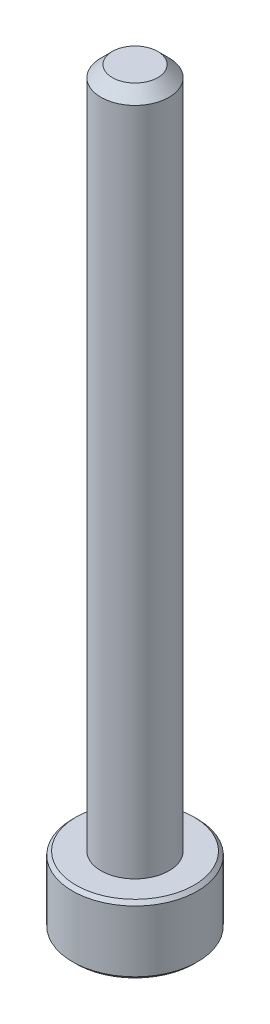
ISO-10303-21;
HEADER;
FILE_DESCRIPTION(('STEP AP214'),'2;1');
FILE_NAME('part.step','',(''),(''),'','','');
FILE_SCHEMA(('AUTOMOTIVE_DESIGN { 1 0 10303 214 1 1 1 1 }'));
ENDSEC;
DATA;
#1=APPLICATION_CONTEXT('core data for automotive mechanical design processes');
#2=APPLICATION_PROTOCOL_DEFINITION('international standard','automotive_design',2000,#1);
#3=PRODUCT_CONTEXT('',#1,'mechanical');
#4=PRODUCT('Part','Part','',(#3));
#5=PRODUCT_RELATED_PRODUCT_CATEGORY('part','',(#4));
#6=PRODUCT_DEFINITION_FORMATION('','',#4);
#7=PRODUCT_DEFINITION_CONTEXT('part definition',#1,'design');
#8=PRODUCT_DEFINITION('design','',#6,#7);
#9=PRODUCT_DEFINITION_SHAPE('','',#8);
#10=(LENGTH_UNIT() NAMED_UNIT(*) SI_UNIT(.MILLI.,.METRE.));
#11=(NAMED_UNIT(*) PLANE_ANGLE_UNIT() SI_UNIT($,.RADIAN.));
#12=(NAMED_UNIT(*) SI_UNIT($,.STERADIAN.) SOLID_ANGLE_UNIT());
#13=UNCERTAINTY_MEASURE_WITH_UNIT(LENGTH_MEASURE(1.E-05),#10,'distance_accuracy_value','');
#14=(GEOMETRIC_REPRESENTATION_CONTEXT(3) GLOBAL_UNCERTAINTY_ASSIGNED_CONTEXT((#13)) GLOBAL_UNIT_ASSIGNED_CONTEXT((#10,
#11,#12)) REPRESENTATION_CONTEXT('',''));
#15=CARTESIAN_POINT('',(0.,0.,0.));
#16=DIRECTION('',(0.,0.,1.));
#17=DIRECTION('',(1.,0.,0.));
#18=AXIS2_PLACEMENT_3D('',#15,#16,#17);
#19=CARTESIAN_POINT('',(-18.4752086140679,34.999999906,-1.25693312378463E-13));
#20=DIRECTION('',(0.,-1.,0.));
#21=DIRECTION('',(0.234491362032753,0.,0.972118203271611));
#22=AXIS2_PLACEMENT_3D('',#19,#20,#21);
#23=CONICAL_SURFACE('',#22,1.,0.785398163397442);
#24=CARTESIAN_POINT('',(-18.4752086140679,34.999999906,-1.25693312378463E-13));
#25=DIRECTION('',(0.,1.,0.));
#26=DIRECTION('',(-0.234491362032753,0.,-0.972118203271611));
#27=AXIS2_PLACEMENT_3D('',#24,#25,#26);
#28=CIRCLE('',#27,1.);
#29=CARTESIAN_POINT('',(-18.7096999761007,34.999999906,-0.972118203271737));
#30=VERTEX_POINT('',#29);
#31=EDGE_CURVE('E240',#30,#30,#28,.T.);
#32=ORIENTED_EDGE('',*,*,#31,.F.);
#33=EDGE_LOOP('',(#32));
#34=FACE_BOUND('',#33,.T.);
#35=CARTESIAN_POINT('',(-18.4752086140679,34.499999906,-1.25669275344883E-13));
#36=DIRECTION('',(0.,1.,0.));
#37=DIRECTION('',(-0.234491362032753,0.,-0.972118203271611));
#38=AXIS2_PLACEMENT_3D('',#35,#36,#37);
#39=CIRCLE('',#38,1.5);
#40=CARTESIAN_POINT('',(-18.8269456571171,34.499999906,-1.45817730490754));
#41=VERTEX_POINT('',#40);
#42=EDGE_CURVE('E11',#41,#41,#39,.T.);
#43=ORIENTED_EDGE('',*,*,#42,.T.);
#44=EDGE_LOOP('',(#43));
#45=FACE_BOUND('',#44,.T.);
#46=ADVANCED_FACE('F16',(#34,#45),#23,.T.);
#47=CARTESIAN_POINT('',(-18.4752086140679,34.999999906,-1.25693312378463E-13));
#48=DIRECTION('',(0.,1.,0.));
#49=DIRECTION('',(-0.234491362032753,0.,-0.972118203271611));
#50=AXIS2_PLACEMENT_3D('',#47,#48,#49);
#51=CYLINDRICAL_SURFACE('',#50,1.5);
#52=CARTESIAN_POINT('',(-18.4752086140679,4.999999906,-1.24251090363675E-13));
#53=DIRECTION('',(0.,1.,0.));
#54=DIRECTION('',(-0.234491362032753,0.,-0.972118203271611));
#55=AXIS2_PLACEMENT_3D('',#52,#53,#54);
#56=CIRCLE('',#55,1.5);
#57=CARTESIAN_POINT('',(-18.8269456571171,4.999999906,-1.45817730490754));
#58=VERTEX_POINT('',#57);
#59=EDGE_CURVE('E243',#58,#58,#56,.T.);
#60=ORIENTED_EDGE('',*,*,#59,.T.);
#61=EDGE_LOOP('',(#60));
#62=FACE_BOUND('',#61,.T.);
#63=ORIENTED_EDGE('',*,*,#42,.F.);
#64=EDGE_LOOP('',(#63));
#65=FACE_BOUND('',#64,.T.);
#66=ADVANCED_FACE('F227',(#62,#65),#51,.T.);
#67=CARTESIAN_POINT('',(-18.4752086140679,4.999999906,-1.24251090363675E-13));
#68=DIRECTION('',(0.,-1.,0.));
#69=DIRECTION('',(0.234491362032753,0.,0.972118203271611));
#70=AXIS2_PLACEMENT_3D('',#67,#68,#69);
#71=CONICAL_SURFACE('',#70,2.6,0.785398163397446);
#72=CARTESIAN_POINT('',(-18.4752086140679,4.999999906,-1.24251090363675E-13));
#73=DIRECTION('',(0.,1.,0.));
#74=DIRECTION('',(-0.234491362032753,0.,-0.972118203271611));
#75=AXIS2_PLACEMENT_3D('',#72,#73,#74);
#76=CIRCLE('',#75,2.6);
#77=CARTESIAN_POINT('',(-19.0848861553531,4.999999906,-2.52750732850631));
#78=VERTEX_POINT('',#77);
#79=EDGE_CURVE('E249',#78,#78,#76,.T.);
#80=ORIENTED_EDGE('',*,*,#79,.F.);
#81=EDGE_LOOP('',(#80));
#82=FACE_BOUND('',#81,.T.);
#83=CARTESIAN_POINT('',(-18.4752086140679,4.849999906,-1.24243879253602E-13));
#84=DIRECTION('',(0.,1.,0.));
#85=DIRECTION('',(-0.234491362032753,0.,-0.972118203271611));
#86=AXIS2_PLACEMENT_3D('',#83,#84,#85);
#87=CIRCLE('',#86,2.75);
#88=CARTESIAN_POINT('',(-19.120059859658,4.849999906,-2.67332505899705));
#89=VERTEX_POINT('',#88);
#90=EDGE_CURVE('E27',#89,#89,#87,.T.);
#91=ORIENTED_EDGE('',*,*,#90,.T.);
#92=EDGE_LOOP('',(#91));
#93=FACE_BOUND('',#92,.T.);
#94=ADVANCED_FACE('F224',(#82,#93),#71,.T.);
#95=CARTESIAN_POINT('',(-18.4752086140679,34.999999906,-1.25693312378463E-13));
#96=DIRECTION('',(0.,1.,0.));
#97=DIRECTION('',(-0.234491362032753,0.,-0.972118203271611));
#98=AXIS2_PLACEMENT_3D('',#95,#96,#97);
#99=CYLINDRICAL_SURFACE('',#98,2.75);
#100=CARTESIAN_POINT('',(-18.4752086140679,2.149999906,-1.24114079272271E-13));
#101=DIRECTION('',(0.,1.,0.));
#102=DIRECTION('',(-0.234491362032753,0.,-0.972118203271611));
#103=AXIS2_PLACEMENT_3D('',#100,#101,#102);
#104=CIRCLE('',#103,2.75);
#105=CARTESIAN_POINT('',(-19.120059859658,2.149999906,-2.67332505899705));
#106=VERTEX_POINT('',#105);
#107=EDGE_CURVE('E256',#106,#106,#104,.T.);
#108=ORIENTED_EDGE('',*,*,#107,.T.);
#109=EDGE_LOOP('',(#108));
#110=FACE_BOUND('',#109,.T.);
#111=ORIENTED_EDGE('',*,*,#90,.F.);
#112=EDGE_LOOP('',(#111));
#113=FACE_BOUND('',#112,.T.);
#114=ADVANCED_FACE('F221',(#110,#113),#99,.T.);
#115=CARTESIAN_POINT('',(-18.4752086140679,2.149999906,-1.24114079272271E-13));
#116=DIRECTION('',(0.,1.,0.));
#117=DIRECTION('',(-0.234491362032753,0.,-0.972118203271611));
#118=AXIS2_PLACEMENT_3D('',#115,#116,#117);
#119=CONICAL_SURFACE('',#118,2.75,0.785398163397457);
#120=CARTESIAN_POINT('',(-18.4752086140679,1.999999906,-1.24106868162197E-13));
#121=DIRECTION('',(0.,1.,0.));
#122=DIRECTION('',(-0.234491362032753,0.,-0.972118203271611));
#123=AXIS2_PLACEMENT_3D('',#120,#121,#122);
#124=CIRCLE('',#123,2.6);
#125=CARTESIAN_POINT('',(-19.0848861553531,1.999999906,-2.52750732850631));
#126=VERTEX_POINT('',#125);
#127=EDGE_CURVE('E253',#126,#126,#124,.T.);
#128=ORIENTED_EDGE('',*,*,#127,.T.);
#129=EDGE_LOOP('',(#128));
#130=FACE_BOUND('',#129,.T.);
#131=ORIENTED_EDGE('',*,*,#107,.F.);
#132=EDGE_LOOP('',(#131));
#133=FACE_BOUND('',#132,.T.);
#134=ADVANCED_FACE('F223',(#130,#133),#119,.T.);
#135=CARTESIAN_POINT('',(-21.0027159425741,1.999999906,0.609677541285032));
#136=DIRECTION('',(0.,-1.,0.));
#137=DIRECTION('',(-1.,0.,0.));
#138=AXIS2_PLACEMENT_3D('',#135,#136,#137);
#139=PLANE('',#138);
#140=CARTESIAN_POINT('',(-18.4752086140679,1.999999906,-1.24106868162197E-13));
#141=DIRECTION('',(0.,-1.,0.));
#142=DIRECTION('',(0.234491362032753,0.,0.972118203271611));
#143=AXIS2_PLACEMENT_3D('',#140,#141,#142);
#144=CIRCLE('',#143,1.44337567297406);
#145=CARTESIAN_POINT('',(-18.1367494865873,1.999999906,1.40313176585737));
#146=VERTEX_POINT('',#145);
#147=CARTESIAN_POINT('',(-19.5211268044172,1.999999906,0.994680085469565));
#148=VERTEX_POINT('',#147);
#149=EDGE_CURVE('E125',#146,#148,#144,.T.);
#150=ORIENTED_EDGE('',*,*,#149,.F.);
#151=CARTESIAN_POINT('',(-18.4752086140679,1.999999906,-1.24106868162197E-13));
#152=DIRECTION('',(0.,-1.,0.));
#153=DIRECTION('',(0.234491362032753,0.,0.972118203271611));
#154=AXIS2_PLACEMENT_3D('',#151,#152,#153);
#155=CIRCLE('',#154,1.44337567297406);
#156=CARTESIAN_POINT('',(-17.0908312962381,1.999999906,0.408451680387684));
#157=VERTEX_POINT('',#156);
#158=EDGE_CURVE('E340',#157,#146,#155,.T.);
#159=ORIENTED_EDGE('',*,*,#158,.F.);
#160=CARTESIAN_POINT('',(-18.4752086140679,1.999999906,-1.24106868162197E-13));
#161=DIRECTION('',(0.,-1.,0.));
#162=DIRECTION('',(0.234491362032753,0.,0.972118203271611));
#163=AXIS2_PLACEMENT_3D('',#160,#161,#162);
#164=CIRCLE('',#163,1.44337567297406);
#165=CARTESIAN_POINT('',(-17.4292904237188,1.999999906,-0.994680085469815));
#166=VERTEX_POINT('',#165);
#167=EDGE_CURVE('E347',#166,#157,#164,.T.);
#168=ORIENTED_EDGE('',*,*,#167,.F.);
#169=CARTESIAN_POINT('',(-18.4752086140679,1.999999906,-1.24106868162197E-13));
#170=DIRECTION('',(0.,-1.,0.));
#171=DIRECTION('',(0.234491362032753,0.,0.972118203271611));
#172=AXIS2_PLACEMENT_3D('',#169,#170,#171);
#173=CIRCLE('',#172,1.44337567297406);
#174=CARTESIAN_POINT('',(-18.8136677415486,1.999999906,-1.40313176585762));
#175=VERTEX_POINT('',#174);
#176=EDGE_CURVE('E355',#175,#166,#173,.T.);
#177=ORIENTED_EDGE('',*,*,#176,.F.);
#178=CARTESIAN_POINT('',(-18.4752086140679,1.999999906,-1.24106868162197E-13));
#179=DIRECTION('',(0.,-1.,0.));
#180=DIRECTION('',(0.234491362032753,0.,0.972118203271611));
#181=AXIS2_PLACEMENT_3D('',#178,#179,#180);
#182=CIRCLE('',#181,1.44337567297406);
#183=CARTESIAN_POINT('',(-19.8595859318977,1.999999906,-0.408451680387932));
#184=VERTEX_POINT('',#183);
#185=EDGE_CURVE('E251',#184,#175,#182,.T.);
#186=ORIENTED_EDGE('',*,*,#185,.F.);
#187=CARTESIAN_POINT('',(-18.4752086140679,1.999999906,-1.24106868162197E-13));
#188=DIRECTION('',(0.,-1.,0.));
#189=DIRECTION('',(0.234491362032753,0.,0.972118203271611));
#190=AXIS2_PLACEMENT_3D('',#187,#188,#189);
#191=CIRCLE('',#190,1.44337567297406);
#192=EDGE_CURVE('E201',#148,#184,#191,.T.);
#193=ORIENTED_EDGE('',*,*,#192,.F.);
#194=EDGE_LOOP('',(#150,#159,#168,#177,#186,#193));
#195=FACE_BOUND('',#194,.T.);
#196=ORIENTED_EDGE('',*,*,#127,.F.);
#197=EDGE_LOOP('',(#196));
#198=FACE_BOUND('',#197,.T.);
#199=ADVANCED_FACE('F219',(#195,#198),#139,.T.);
#200=CARTESIAN_POINT('',(-21.0027159425741,4.999999906,0.609677541285032));
#201=DIRECTION('',(0.,1.,0.));
#202=DIRECTION('',(0.,0.,-1.));
#203=AXIS2_PLACEMENT_3D('',#200,#201,#202);
#204=PLANE('',#203);
#205=ORIENTED_EDGE('',*,*,#79,.T.);
#206=EDGE_LOOP('',(#205));
#207=FACE_BOUND('',#206,.T.);
#208=ORIENTED_EDGE('',*,*,#59,.F.);
#209=EDGE_LOOP('',(#208));
#210=FACE_BOUND('',#209,.T.);
#211=ADVANCED_FACE('F216',(#207,#210),#204,.T.);
#212=CARTESIAN_POINT('',(-19.4473268173395,34.999999906,0.234491362032627));
#213=DIRECTION('',(0.,1.,0.));
#214=DIRECTION('',(0.,0.,-1.));
#215=AXIS2_PLACEMENT_3D('',#212,#213,#214);
#216=PLANE('',#215);
#217=ORIENTED_EDGE('',*,*,#31,.T.);
#218=EDGE_LOOP('',(#217));
#219=FACE_BOUND('',#218,.T.);
#220=ADVANCED_FACE('F214',(#219),#216,.T.);
#221=CARTESIAN_POINT('',(-18.4752086140679,1.999999906,-1.24106868162197E-13));
#222=DIRECTION('',(0.,-1.,0.));
#223=DIRECTION('',(0.234491362032753,0.,0.972118203271611));
#224=AXIS2_PLACEMENT_3D('',#221,#222,#223);
#225=CONICAL_SURFACE('',#224,1.44337567297406,0.78539816339745);
#226=ORIENTED_EDGE('',*,*,#192,.T.);
#227=CARTESIAN_POINT('',(-19.5211268044172,1.999999906,0.994680085469565));
#228=CARTESIAN_POINT('',(-19.611639875145,2.19299863726072,0.619444925735824));
#229=CARTESIAN_POINT('',(-19.6897334658809,2.19337275639813,0.295696534942112));
#230=CARTESIAN_POINT('',(-19.7687199442659,2.19375115304863,-0.0317534520628156));
#231=CARTESIAN_POINT('',(-19.8595859318978,1.999999906,-0.408451680387902));
#232=B_SPLINE_CURVE_WITH_KNOTS('',2,(#227,#228,#229,#230,#231),.UNSPECIFIED.,.F.,.F.,(3,2,3),
(0.,0.5,1.),.UNSPECIFIED.);
#233=EDGE_CURVE('E126',#148,#184,#232,.T.);
#234=ORIENTED_EDGE('',*,*,#233,.F.);
#235=EDGE_LOOP('',(#226,#234));
#236=FACE_BOUND('',#235,.T.);
#237=ADVANCED_FACE('F203',(#236),#225,.F.);
#238=CARTESIAN_POINT('',(-18.4752086140679,1.999999906,-1.24106868162197E-13));
#239=DIRECTION('',(0.,-1.,0.));
#240=DIRECTION('',(0.234491362032753,0.,0.972118203271611));
#241=AXIS2_PLACEMENT_3D('',#238,#239,#240);
#242=CONICAL_SURFACE('',#241,1.44337567297406,0.78539816339745);
#243=ORIENTED_EDGE('',*,*,#185,.T.);
#244=CARTESIAN_POINT('',(-19.8595859318977,1.99999990599999,-0.408451680387933));
#245=CARTESIAN_POINT('',(-19.5798792865387,2.19299863726101,-0.674455878880027));
#246=CARTESIAN_POINT('',(-19.3385517510453,2.19337275639814,-0.903961107726446));
#247=CARTESIAN_POINT('',(-19.0944649830223,2.19375115304836,-1.13609039806617));
#248=CARTESIAN_POINT('',(-18.8136677415486,1.99999990599999,-1.40313176585757));
#249=B_SPLINE_CURVE_WITH_KNOTS('',2,(#244,#245,#246,#247,#248),.UNSPECIFIED.,.F.,.F.,(3,2,3),
(0.,0.5,1.),.UNSPECIFIED.);
#250=EDGE_CURVE('E137',#184,#175,#249,.T.);
#251=ORIENTED_EDGE('',*,*,#250,.F.);
#252=EDGE_LOOP('',(#243,#251));
#253=FACE_BOUND('',#252,.T.);
#254=ADVANCED_FACE('F213',(#253),#242,.F.);
#255=CARTESIAN_POINT('',(-18.4752086140679,1.999999906,-1.24106868162197E-13));
#256=DIRECTION('',(0.,-1.,0.));
#257=DIRECTION('',(0.234491362032753,0.,0.972118203271611));
#258=AXIS2_PLACEMENT_3D('',#255,#256,#257);
#259=CONICAL_SURFACE('',#258,1.44337567297406,0.78539816339745);
#260=ORIENTED_EDGE('',*,*,#176,.T.);
#261=CARTESIAN_POINT('',(-18.8136677415486,1.999999906,-1.40313176585762));
#262=CARTESIAN_POINT('',(-18.4434480254626,2.19299863726046,-1.29390080461574));
#263=CARTESIAN_POINT('',(-18.1240268992326,2.19337275639814,-1.1996576426687));
#264=CARTESIAN_POINT('',(-17.8009536528254,2.19375115304892,-1.10433694600329));
#265=CARTESIAN_POINT('',(-17.4292904237188,1.999999906,-0.994680085469819));
#266=B_SPLINE_CURVE_WITH_KNOTS('',2,(#261,#262,#263,#264,#265),.UNSPECIFIED.,.F.,.F.,(3,2,3),
(0.,0.5,1.),.UNSPECIFIED.);
#267=EDGE_CURVE('E152',#175,#166,#266,.T.);
#268=ORIENTED_EDGE('',*,*,#267,.F.);
#269=EDGE_LOOP('',(#260,#268));
#270=FACE_BOUND('',#269,.T.);
#271=ADVANCED_FACE('F331',(#270),#259,.F.);
#272=CARTESIAN_POINT('',(-18.4752086140679,1.999999906,-1.24106868162197E-13));
#273=DIRECTION('',(0.,-1.,0.));
#274=DIRECTION('',(0.234491362032753,0.,0.972118203271611));
#275=AXIS2_PLACEMENT_3D('',#272,#273,#274);
#276=CONICAL_SURFACE('',#275,1.44337567297406,0.78539816339745);
#277=ORIENTED_EDGE('',*,*,#167,.T.);
#278=CARTESIAN_POINT('',(-17.4292904237188,1.999999906,-0.994680085469815));
#279=CARTESIAN_POINT('',(-17.3387773529908,2.19299863726101,-0.619444925735482));
#280=CARTESIAN_POINT('',(-17.2606837622551,2.19337275639813,-0.295696534942333));
#281=CARTESIAN_POINT('',(-17.18169728387,2.19375115304835,0.0317534520631036));
#282=CARTESIAN_POINT('',(-17.0908312962382,1.999999906,0.4084516803877));
#283=B_SPLINE_CURVE_WITH_KNOTS('',2,(#278,#279,#280,#281,#282),.UNSPECIFIED.,.F.,.F.,(3,2,3),
(0.,0.5,1.),.UNSPECIFIED.);
#284=EDGE_CURVE('E276',#166,#157,#283,.T.);
#285=ORIENTED_EDGE('',*,*,#284,.F.);
#286=EDGE_LOOP('',(#277,#285));
#287=FACE_BOUND('',#286,.T.);
#288=ADVANCED_FACE('F326',(#287),#276,.F.);
#289=CARTESIAN_POINT('',(-18.4752086140679,1.999999906,-1.24106868162197E-13));
#290=DIRECTION('',(0.,-1.,0.));
#291=DIRECTION('',(0.234491362032753,0.,0.972118203271611));
#292=AXIS2_PLACEMENT_3D('',#289,#290,#291);
#293=CONICAL_SURFACE('',#292,1.44337567297406,0.78539816339745);
#294=ORIENTED_EDGE('',*,*,#158,.T.);
#295=CARTESIAN_POINT('',(-17.0908312962381,1.999999906,0.408451680387684));
#296=CARTESIAN_POINT('',(-17.3705379415967,2.19299863726071,0.674455878879416));
#297=CARTESIAN_POINT('',(-17.6118654770905,2.19337275639812,0.903961107726228));
#298=CARTESIAN_POINT('',(-17.8559522451132,2.19375115304862,1.13609039806563));
#299=CARTESIAN_POINT('',(-18.1367494865873,1.999999906,1.40313176585737));
#300=B_SPLINE_CURVE_WITH_KNOTS('',2,(#295,#296,#297,#298,#299),.UNSPECIFIED.,.F.,.F.,(3,2,3),
(0.,0.5,1.),.UNSPECIFIED.);
#301=EDGE_CURVE('E281',#157,#146,#300,.T.);
#302=ORIENTED_EDGE('',*,*,#301,.F.);
#303=EDGE_LOOP('',(#294,#302));
#304=FACE_BOUND('',#303,.T.);
#305=ADVANCED_FACE('F330',(#304),#293,.F.);
#306=CARTESIAN_POINT('',(-18.4752086140679,1.999999906,-1.24106868162197E-13));
#307=DIRECTION('',(0.,-1.,0.));
#308=DIRECTION('',(0.234491362032753,0.,0.972118203271611));
#309=AXIS2_PLACEMENT_3D('',#306,#307,#308);
#310=CONICAL_SURFACE('',#309,1.44337567297406,0.78539816339745);
#311=ORIENTED_EDGE('',*,*,#149,.T.);
#312=CARTESIAN_POINT('',(-18.1367494865873,1.999999906,1.40313176585737));
#313=CARTESIAN_POINT('',(-18.5069692026733,2.19299863726046,1.29390080461549));
#314=CARTESIAN_POINT('',(-18.8263903289033,2.19337275639814,1.19965764266845));
#315=CARTESIAN_POINT('',(-19.1494635753104,2.19375115304892,1.10433694600306));
#316=CARTESIAN_POINT('',(-19.5211268044172,1.999999906,0.994680085469542));
#317=B_SPLINE_CURVE_WITH_KNOTS('',2,(#312,#313,#314,#315,#316),.UNSPECIFIED.,.F.,.F.,(3,2,3),
(0.,0.5,1.),.UNSPECIFIED.);
#318=EDGE_CURVE('E368',#146,#148,#317,.T.);
#319=ORIENTED_EDGE('',*,*,#318,.F.);
#320=EDGE_LOOP('',(#311,#319));
#321=FACE_BOUND('',#320,.T.);
#322=ADVANCED_FACE('F181',(#321),#310,.F.);
#323=CARTESIAN_POINT('',(-21.0027159425741,3.499999906,0.609677541285032));
#324=DIRECTION('',(0.,-1.,0.));
#325=DIRECTION('',(-1.,0.,0.));
#326=AXIS2_PLACEMENT_3D('',#323,#324,#325);
#327=PLANE('',#326);
#328=DIRECTION('',(0.959124740530876,0.,0.282983625147428));
#329=VECTOR('',#328,1.);
#330=CARTESIAN_POINT('',(-18.1367494865873,3.499999906,1.40313176585737));
#331=LINE('',#330,#329);
#332=CARTESIAN_POINT('',(-19.5211268044172,3.499999906,0.994680085469566));
#333=VERTEX_POINT('',#332);
#334=CARTESIAN_POINT('',(-18.1367494865873,3.499999906,1.40313176585737));
#335=VERTEX_POINT('',#334);
#336=EDGE_CURVE('E119',#333,#335,#331,.T.);
#337=ORIENTED_EDGE('',*,*,#336,.F.);
#338=DIRECTION('',(0.234491362032753,0.,0.972118203271611));
#339=VECTOR('',#338,1.);
#340=CARTESIAN_POINT('',(-19.5211268044172,3.499999906,0.994680085469566));
#341=LINE('',#340,#339);
#342=CARTESIAN_POINT('',(-19.8595859318977,3.499999906,-0.408451680387933));
#343=VERTEX_POINT('',#342);
#344=EDGE_CURVE('E113',#343,#333,#341,.T.);
#345=ORIENTED_EDGE('',*,*,#344,.F.);
#346=DIRECTION('',(-0.724633378498124,0.,0.689134578124183));
#347=VECTOR('',#346,1.);
#348=CARTESIAN_POINT('',(-19.8595859318977,3.499999906,-0.408451680387933));
#349=LINE('',#348,#347);
#350=CARTESIAN_POINT('',(-18.8136677415486,3.499999906,-1.40313176585762));
#351=VERTEX_POINT('',#350);
#352=EDGE_CURVE('E116',#351,#343,#349,.T.);
#353=ORIENTED_EDGE('',*,*,#352,.F.);
#354=DIRECTION('',(-0.959124740530876,0.,-0.282983625147428));
#355=VECTOR('',#354,1.);
#356=CARTESIAN_POINT('',(-18.8136677415486,3.499999906,-1.40313176585762));
#357=LINE('',#356,#355);
#358=CARTESIAN_POINT('',(-17.4292904237188,3.499999906,-0.994680085469815));
#359=VERTEX_POINT('',#358);
#360=EDGE_CURVE('E145',#359,#351,#357,.T.);
#361=ORIENTED_EDGE('',*,*,#360,.F.);
#362=DIRECTION('',(-0.234491362032753,0.,-0.972118203271611));
#363=VECTOR('',#362,1.);
#364=CARTESIAN_POINT('',(-17.4292904237188,3.499999906,-0.994680085469815));
#365=LINE('',#364,#363);
#366=CARTESIAN_POINT('',(-17.0908312962381,3.499999906,0.408451680387683));
#367=VERTEX_POINT('',#366);
#368=EDGE_CURVE('E272',#367,#359,#365,.T.);
#369=ORIENTED_EDGE('',*,*,#368,.F.);
#370=DIRECTION('',(0.724633378498124,0.,-0.689134578124183));
#371=VECTOR('',#370,1.);
#372=CARTESIAN_POINT('',(-17.0908312962381,3.499999906,0.408451680387683));
#373=LINE('',#372,#371);
#374=EDGE_CURVE('E277',#335,#367,#373,.T.);
#375=ORIENTED_EDGE('',*,*,#374,.F.);
#376=EDGE_LOOP('',(#337,#345,#353,#361,#369,#375));
#377=FACE_BOUND('',#376,.T.);
#378=ADVANCED_FACE('F115',(#377),#327,.T.);
#379=CARTESIAN_POINT('',(-19.5211268044172,8.81881298512987,0.994680085469566));
#380=DIRECTION('',(-0.972118203271611,0.,0.234491362032753));
#381=DIRECTION('',(0.,1.,0.));
#382=AXIS2_PLACEMENT_3D('',#379,#380,#381);
#383=PLANE('',#382);
#384=DIRECTION('',(0.,-1.,0.));
#385=VECTOR('',#384,1.);
#386=CARTESIAN_POINT('',(-19.5211268044172,8.81881298512987,0.994680085469566));
#387=LINE('',#386,#385);
#388=EDGE_CURVE('E269',#333,#148,#387,.T.);
#389=ORIENTED_EDGE('',*,*,#388,.T.);
#390=ORIENTED_EDGE('',*,*,#233,.T.);
#391=DIRECTION('',(0.,-1.,0.));
#392=VECTOR('',#391,1.);
#393=CARTESIAN_POINT('',(-19.8595859318977,8.81881298512987,-0.408451680387933));
#394=LINE('',#393,#392);
#395=EDGE_CURVE('E133',#343,#184,#394,.T.);
#396=ORIENTED_EDGE('',*,*,#395,.F.);
#397=ORIENTED_EDGE('',*,*,#344,.T.);
#398=EDGE_LOOP('',(#389,#390,#396,#397));
#399=FACE_BOUND('',#398,.T.);
#400=ADVANCED_FACE('F140',(#399),#383,.F.);
#401=CARTESIAN_POINT('',(-19.8595859318977,8.81881298512987,-0.408451680387933));
#402=DIRECTION('',(-0.689134578124183,0.,-0.724633378498124));
#403=DIRECTION('',(-0.724633378498124,0.,0.689134578124183));
#404=AXIS2_PLACEMENT_3D('',#401,#402,#403);
#405=PLANE('',#404);
#406=ORIENTED_EDGE('',*,*,#395,.T.);
#407=ORIENTED_EDGE('',*,*,#250,.T.);
#408=DIRECTION('',(0.,-1.,0.));
#409=VECTOR('',#408,1.);
#410=CARTESIAN_POINT('',(-18.8136677415486,8.81881298512987,-1.40313176585762));
#411=LINE('',#410,#409);
#412=EDGE_CURVE('E135',#351,#175,#411,.T.);
#413=ORIENTED_EDGE('',*,*,#412,.F.);
#414=ORIENTED_EDGE('',*,*,#352,.T.);
#415=EDGE_LOOP('',(#406,#407,#413,#414));
#416=FACE_BOUND('',#415,.T.);
#417=ADVANCED_FACE('F131',(#416),#405,.F.);
#418=CARTESIAN_POINT('',(-18.8136677415486,8.81881298512987,-1.40313176585762));
#419=DIRECTION('',(0.282983625147428,0.,-0.959124740530876));
#420=DIRECTION('',(0.,-1.,0.));
#421=AXIS2_PLACEMENT_3D('',#418,#419,#420);
#422=PLANE('',#421);
#423=ORIENTED_EDGE('',*,*,#412,.T.);
#424=ORIENTED_EDGE('',*,*,#267,.T.);
#425=DIRECTION('',(0.,-1.,0.));
#426=VECTOR('',#425,1.);
#427=CARTESIAN_POINT('',(-17.4292904237188,8.81881298512987,-0.994680085469816));
#428=LINE('',#427,#426);
#429=EDGE_CURVE('E280',#359,#166,#428,.T.);
#430=ORIENTED_EDGE('',*,*,#429,.F.);
#431=ORIENTED_EDGE('',*,*,#360,.T.);
#432=EDGE_LOOP('',(#423,#424,#430,#431));
#433=FACE_BOUND('',#432,.T.);
#434=ADVANCED_FACE('F176',(#433),#422,.F.);
#435=CARTESIAN_POINT('',(-17.4292904237188,8.81881298512987,-0.994680085469816));
#436=DIRECTION('',(0.972118203271611,0.,-0.234491362032753));
#437=DIRECTION('',(0.,-1.,0.));
#438=AXIS2_PLACEMENT_3D('',#435,#436,#437);
#439=PLANE('',#438);
#440=ORIENTED_EDGE('',*,*,#429,.T.);
#441=ORIENTED_EDGE('',*,*,#284,.T.);
#442=DIRECTION('',(0.,-1.,0.));
#443=VECTOR('',#442,1.);
#444=CARTESIAN_POINT('',(-17.0908312962381,8.81881298512987,0.408451680387683));
#445=LINE('',#444,#443);
#446=EDGE_CURVE('E268',#367,#157,#445,.T.);
#447=ORIENTED_EDGE('',*,*,#446,.F.);
#448=ORIENTED_EDGE('',*,*,#368,.T.);
#449=EDGE_LOOP('',(#440,#441,#447,#448));
#450=FACE_BOUND('',#449,.T.);
#451=ADVANCED_FACE('F324',(#450),#439,.F.);
#452=CARTESIAN_POINT('',(-17.0908312962381,8.81881298512987,0.408451680387683));
#453=DIRECTION('',(0.689134578124183,0.,0.724633378498124));
#454=DIRECTION('',(0.,-1.,0.));
#455=AXIS2_PLACEMENT_3D('',#452,#453,#454);
#456=PLANE('',#455);
#457=ORIENTED_EDGE('',*,*,#446,.T.);
#458=ORIENTED_EDGE('',*,*,#301,.T.);
#459=DIRECTION('',(0.,-1.,0.));
#460=VECTOR('',#459,1.);
#461=CARTESIAN_POINT('',(-18.1367494865873,8.81881298512987,1.40313176585737));
#462=LINE('',#461,#460);
#463=EDGE_CURVE('E421',#335,#146,#462,.T.);
#464=ORIENTED_EDGE('',*,*,#463,.F.);
#465=ORIENTED_EDGE('',*,*,#374,.T.);
#466=EDGE_LOOP('',(#457,#458,#464,#465));
#467=FACE_BOUND('',#466,.T.);
#468=ADVANCED_FACE('F313',(#467),#456,.F.);
#469=CARTESIAN_POINT('',(-18.1367494865873,8.81881298512987,1.40313176585737));
#470=DIRECTION('',(-0.282983625147428,0.,0.959124740530876));
#471=DIRECTION('',(0.,1.,0.));
#472=AXIS2_PLACEMENT_3D('',#469,#470,#471);
#473=PLANE('',#472);
#474=ORIENTED_EDGE('',*,*,#463,.T.);
#475=ORIENTED_EDGE('',*,*,#318,.T.);
#476=ORIENTED_EDGE('',*,*,#388,.F.);
#477=ORIENTED_EDGE('',*,*,#336,.T.);
#478=EDGE_LOOP('',(#474,#475,#476,#477));
#479=FACE_BOUND('',#478,.T.);
#480=ADVANCED_FACE('F323',(#479),#473,.F.);
#481=CLOSED_SHELL('',(#46,#66,#94,#114,#134,#199,#211,#220,#237,#254,#271,#288,#305,#322,#378,
#400,#417,#434,#451,#468,#480));
#482=MANIFOLD_SOLID_BREP('B1',#481);
#483=ADVANCED_BREP_SHAPE_REPRESENTATION('',(#18,#482),#14);
#484=SHAPE_DEFINITION_REPRESENTATION(#9,#483);
ENDSEC;
END-ISO-10303-21;
